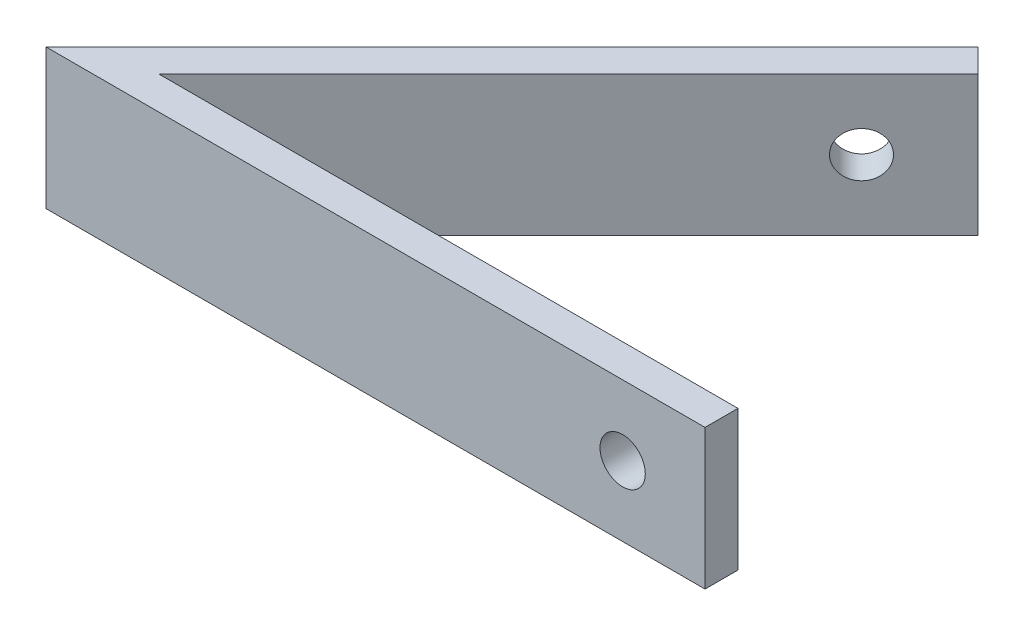
ISO-10303-21;
HEADER;
FILE_DESCRIPTION(('STEP AP214'),'2;1');
FILE_NAME('part.step','',(''),(''),'','','');
FILE_SCHEMA(('AUTOMOTIVE_DESIGN { 1 0 10303 214 1 1 1 1 }'));
ENDSEC;
DATA;
#1=APPLICATION_CONTEXT('core data for automotive mechanical design processes');
#2=APPLICATION_PROTOCOL_DEFINITION('international standard','automotive_design',2000,#1);
#3=PRODUCT_CONTEXT('',#1,'mechanical');
#4=PRODUCT('Part','Part','',(#3));
#5=PRODUCT_RELATED_PRODUCT_CATEGORY('part','',(#4));
#6=PRODUCT_DEFINITION_FORMATION('','',#4);
#7=PRODUCT_DEFINITION_CONTEXT('part definition',#1,'design');
#8=PRODUCT_DEFINITION('design','',#6,#7);
#9=PRODUCT_DEFINITION_SHAPE('','',#8);
#10=(LENGTH_UNIT() NAMED_UNIT(*) SI_UNIT(.MILLI.,.METRE.));
#11=(NAMED_UNIT(*) PLANE_ANGLE_UNIT() SI_UNIT($,.RADIAN.));
#12=(NAMED_UNIT(*) SI_UNIT($,.STERADIAN.) SOLID_ANGLE_UNIT());
#13=UNCERTAINTY_MEASURE_WITH_UNIT(LENGTH_MEASURE(1.E-05),#10,'distance_accuracy_value','');
#14=(GEOMETRIC_REPRESENTATION_CONTEXT(3) GLOBAL_UNCERTAINTY_ASSIGNED_CONTEXT((#13)) GLOBAL_UNIT_ASSIGNED_CONTEXT((#10,
#11,#12)) REPRESENTATION_CONTEXT('',''));
#15=CARTESIAN_POINT('',(0.,0.,0.));
#16=DIRECTION('',(0.,0.,1.));
#17=DIRECTION('',(1.,0.,0.));
#18=AXIS2_PLACEMENT_3D('',#15,#16,#17);
#19=CARTESIAN_POINT('',(80.,17.,0.));
#20=DIRECTION('',(-1.,0.,0.));
#21=DIRECTION('',(0.,0.,1.));
#22=AXIS2_PLACEMENT_3D('',#19,#20,#21);
#23=PLANE('',#22);
#24=DIRECTION('',(0.,0.,-1.));
#25=VECTOR('',#24,1.);
#26=CARTESIAN_POINT('',(80.,0.,0.));
#27=LINE('',#26,#25);
#28=CARTESIAN_POINT('',(80.,0.,0.));
#29=VERTEX_POINT('',#28);
#30=CARTESIAN_POINT('',(80.,0.,-4.));
#31=VERTEX_POINT('',#30);
#32=EDGE_CURVE('E120',#29,#31,#27,.T.);
#33=ORIENTED_EDGE('',*,*,#32,.T.);
#34=DIRECTION('',(0.,-1.,0.));
#35=VECTOR('',#34,1.);
#36=CARTESIAN_POINT('',(80.,17.,-4.));
#37=LINE('',#36,#35);
#38=CARTESIAN_POINT('',(80.,17.,-4.));
#39=VERTEX_POINT('',#38);
#40=EDGE_CURVE('E11',#39,#31,#37,.T.);
#41=ORIENTED_EDGE('',*,*,#40,.F.);
#42=DIRECTION('',(0.,0.,-1.));
#43=VECTOR('',#42,1.);
#44=CARTESIAN_POINT('',(80.,17.,0.));
#45=LINE('',#44,#43);
#46=CARTESIAN_POINT('',(80.,17.,0.));
#47=VERTEX_POINT('',#46);
#48=EDGE_CURVE('E130',#47,#39,#45,.T.);
#49=ORIENTED_EDGE('',*,*,#48,.F.);
#50=DIRECTION('',(0.,-1.,0.));
#51=VECTOR('',#50,1.);
#52=CARTESIAN_POINT('',(80.,17.,0.));
#53=LINE('',#52,#51);
#54=EDGE_CURVE('E116',#47,#29,#53,.T.);
#55=ORIENTED_EDGE('',*,*,#54,.T.);
#56=EDGE_LOOP('',(#33,#41,#49,#55));
#57=FACE_BOUND('',#56,.T.);
#58=ADVANCED_FACE('F35',(#57),#23,.F.);
#59=CARTESIAN_POINT('',(80.,17.,-4.));
#60=DIRECTION('',(0.,0.,1.));
#61=DIRECTION('',(1.,0.,0.));
#62=AXIS2_PLACEMENT_3D('',#59,#60,#61);
#63=PLANE('',#62);
#64=CARTESIAN_POINT('',(70.,8.5,-4.));
#65=DIRECTION('',(0.,0.,1.));
#66=DIRECTION('',(1.,0.,0.));
#67=AXIS2_PLACEMENT_3D('',#64,#65,#66);
#68=CIRCLE('',#67,2.75000000000001);
#69=CARTESIAN_POINT('',(72.75,8.5,-4.));
#70=VERTEX_POINT('',#69);
#71=EDGE_CURVE('E231',#70,#70,#68,.T.);
#72=ORIENTED_EDGE('',*,*,#71,.T.);
#73=EDGE_LOOP('',(#72));
#74=FACE_BOUND('',#73,.T.);
#75=DIRECTION('',(-1.,0.,0.));
#76=VECTOR('',#75,1.);
#77=CARTESIAN_POINT('',(80.,0.,-4.));
#78=LINE('',#77,#76);
#79=CARTESIAN_POINT('',(9.65685424949238,0.,-4.));
#80=VERTEX_POINT('',#79);
#81=EDGE_CURVE('E123',#31,#80,#78,.T.);
#82=ORIENTED_EDGE('',*,*,#81,.T.);
#83=DIRECTION('',(0.,-1.,0.));
#84=VECTOR('',#83,1.);
#85=CARTESIAN_POINT('',(9.65685424949238,17.,-4.));
#86=LINE('',#85,#84);
#87=CARTESIAN_POINT('',(9.65685424949238,17.,-4.));
#88=VERTEX_POINT('',#87);
#89=EDGE_CURVE('E44',#88,#80,#86,.T.);
#90=ORIENTED_EDGE('',*,*,#89,.F.);
#91=DIRECTION('',(-1.,0.,0.));
#92=VECTOR('',#91,1.);
#93=CARTESIAN_POINT('',(80.,17.,-4.));
#94=LINE('',#93,#92);
#95=EDGE_CURVE('E89',#39,#88,#94,.T.);
#96=ORIENTED_EDGE('',*,*,#95,.F.);
#97=ORIENTED_EDGE('',*,*,#40,.T.);
#98=EDGE_LOOP('',(#82,#90,#96,#97));
#99=FACE_BOUND('',#98,.T.);
#100=ADVANCED_FACE('F158',(#74,#99),#63,.F.);
#101=CARTESIAN_POINT('',(9.65685424949238,17.,-4.));
#102=DIRECTION('',(-0.707106781186547,0.,-0.707106781186548));
#103=DIRECTION('',(-0.707106781186548,0.,0.707106781186547));
#104=AXIS2_PLACEMENT_3D('',#101,#102,#103);
#105=PLANE('',#104);
#106=CARTESIAN_POINT('',(52.3259018078045,8.5,-46.6690475583121));
#107=DIRECTION('',(0.707106781186548,0.,0.707106781186548));
#108=DIRECTION('',(0.707106781186548,0.,-0.707106781186548));
#109=AXIS2_PLACEMENT_3D('',#106,#107,#108);
#110=CIRCLE('',#109,2.75000000000001);
#111=CARTESIAN_POINT('',(54.2704454560675,8.5,-48.6135912065752));
#112=VERTEX_POINT('',#111);
#113=EDGE_CURVE('E232',#112,#112,#110,.T.);
#114=ORIENTED_EDGE('',*,*,#113,.F.);
#115=EDGE_LOOP('',(#114));
#116=FACE_BOUND('',#115,.T.);
#117=DIRECTION('',(0.707106781186548,0.,-0.707106781186547));
#118=VECTOR('',#117,1.);
#119=CARTESIAN_POINT('',(9.65685424949238,0.,-4.));
#120=LINE('',#119,#118);
#121=CARTESIAN_POINT('',(59.39696961967,0.,-53.7401153701776));
#122=VERTEX_POINT('',#121);
#123=EDGE_CURVE('E125',#80,#122,#120,.T.);
#124=ORIENTED_EDGE('',*,*,#123,.T.);
#125=DIRECTION('',(0.,-1.,0.));
#126=VECTOR('',#125,1.);
#127=CARTESIAN_POINT('',(59.39696961967,17.,-53.7401153701776));
#128=LINE('',#127,#126);
#129=CARTESIAN_POINT('',(59.39696961967,17.,-53.7401153701776));
#130=VERTEX_POINT('',#129);
#131=EDGE_CURVE('E111',#130,#122,#128,.T.);
#132=ORIENTED_EDGE('',*,*,#131,.F.);
#133=DIRECTION('',(0.707106781186548,0.,-0.707106781186547));
#134=VECTOR('',#133,1.);
#135=CARTESIAN_POINT('',(9.65685424949238,17.,-4.));
#136=LINE('',#135,#134);
#137=EDGE_CURVE('E102',#88,#130,#136,.T.);
#138=ORIENTED_EDGE('',*,*,#137,.F.);
#139=ORIENTED_EDGE('',*,*,#89,.T.);
#140=EDGE_LOOP('',(#124,#132,#138,#139));
#141=FACE_BOUND('',#140,.T.);
#142=ADVANCED_FACE('F137',(#116,#141),#105,.F.);
#143=CARTESIAN_POINT('',(56.5685424949238,17.,-56.5685424949238));
#144=DIRECTION('',(-0.707106781186544,0.,0.707106781186551));
#145=DIRECTION('',(0.707106781186551,0.,0.707106781186544));
#146=AXIS2_PLACEMENT_3D('',#143,#144,#145);
#147=PLANE('',#146);
#148=DIRECTION('',(-0.707106781186551,0.,-0.707106781186544));
#149=VECTOR('',#148,1.);
#150=CARTESIAN_POINT('',(56.5685424949238,0.,-56.5685424949238));
#151=LINE('',#150,#149);
#152=CARTESIAN_POINT('',(56.5685424949238,0.,-56.5685424949238));
#153=VERTEX_POINT('',#152);
#154=EDGE_CURVE('E110',#122,#153,#151,.T.);
#155=ORIENTED_EDGE('',*,*,#154,.T.);
#156=DIRECTION('',(0.,-1.,0.));
#157=VECTOR('',#156,1.);
#158=CARTESIAN_POINT('',(56.5685424949238,17.,-56.5685424949238));
#159=LINE('',#158,#157);
#160=CARTESIAN_POINT('',(56.5685424949238,17.,-56.5685424949238));
#161=VERTEX_POINT('',#160);
#162=EDGE_CURVE('E107',#161,#153,#159,.T.);
#163=ORIENTED_EDGE('',*,*,#162,.F.);
#164=DIRECTION('',(-0.707106781186551,0.,-0.707106781186544));
#165=VECTOR('',#164,1.);
#166=CARTESIAN_POINT('',(56.5685424949238,17.,-56.5685424949238));
#167=LINE('',#166,#165);
#168=EDGE_CURVE('E96',#130,#161,#167,.T.);
#169=ORIENTED_EDGE('',*,*,#168,.F.);
#170=ORIENTED_EDGE('',*,*,#131,.T.);
#171=EDGE_LOOP('',(#155,#163,#169,#170));
#172=FACE_BOUND('',#171,.T.);
#173=ADVANCED_FACE('F108',(#172),#147,.F.);
#174=CARTESIAN_POINT('',(0.,17.,0.));
#175=DIRECTION('',(0.707106781186547,0.,0.707106781186547));
#176=DIRECTION('',(0.707106781186548,0.,-0.707106781186548));
#177=AXIS2_PLACEMENT_3D('',#174,#175,#176);
#178=PLANE('',#177);
#179=CARTESIAN_POINT('',(49.4974746830583,8.5,-49.4974746830583));
#180=DIRECTION('',(0.707106781186547,0.,0.707106781186547));
#181=DIRECTION('',(0.707106781186548,0.,-0.707106781186548));
#182=AXIS2_PLACEMENT_3D('',#179,#180,#181);
#183=CIRCLE('',#182,2.75000000000001);
#184=CARTESIAN_POINT('',(51.4420183313213,8.5,-51.4420183313213));
#185=VERTEX_POINT('',#184);
#186=EDGE_CURVE('E38',#185,#185,#183,.T.);
#187=ORIENTED_EDGE('',*,*,#186,.T.);
#188=EDGE_LOOP('',(#187));
#189=FACE_BOUND('',#188,.T.);
#190=DIRECTION('',(-0.707106781186548,0.,0.707106781186548));
#191=VECTOR('',#190,1.);
#192=CARTESIAN_POINT('',(0.,0.,0.));
#193=LINE('',#192,#191);
#194=CARTESIAN_POINT('',(0.,0.,0.));
#195=VERTEX_POINT('',#194);
#196=EDGE_CURVE('E75',#153,#195,#193,.T.);
#197=ORIENTED_EDGE('',*,*,#196,.T.);
#198=DIRECTION('',(0.,-1.,0.));
#199=VECTOR('',#198,1.);
#200=CARTESIAN_POINT('',(0.,17.,0.));
#201=LINE('',#200,#199);
#202=CARTESIAN_POINT('',(0.,17.,0.));
#203=VERTEX_POINT('',#202);
#204=EDGE_CURVE('E112',#203,#195,#201,.T.);
#205=ORIENTED_EDGE('',*,*,#204,.F.);
#206=DIRECTION('',(-0.707106781186548,0.,0.707106781186548));
#207=VECTOR('',#206,1.);
#208=CARTESIAN_POINT('',(0.,17.,0.));
#209=LINE('',#208,#207);
#210=EDGE_CURVE('E100',#161,#203,#209,.T.);
#211=ORIENTED_EDGE('',*,*,#210,.F.);
#212=ORIENTED_EDGE('',*,*,#162,.T.);
#213=EDGE_LOOP('',(#197,#205,#211,#212));
#214=FACE_BOUND('',#213,.T.);
#215=ADVANCED_FACE('F114',(#189,#214),#178,.F.);
#216=CARTESIAN_POINT('',(80.,17.,0.));
#217=DIRECTION('',(0.,0.,-1.));
#218=DIRECTION('',(-1.,0.,0.));
#219=AXIS2_PLACEMENT_3D('',#216,#217,#218);
#220=PLANE('',#219);
#221=CARTESIAN_POINT('',(70.,8.5,0.));
#222=DIRECTION('',(0.,0.,1.));
#223=DIRECTION('',(1.,0.,0.));
#224=AXIS2_PLACEMENT_3D('',#221,#222,#223);
#225=CIRCLE('',#224,2.75000000000001);
#226=CARTESIAN_POINT('',(72.75,8.5,0.));
#227=VERTEX_POINT('',#226);
#228=EDGE_CURVE('E229',#227,#227,#225,.T.);
#229=ORIENTED_EDGE('',*,*,#228,.F.);
#230=EDGE_LOOP('',(#229));
#231=FACE_BOUND('',#230,.T.);
#232=DIRECTION('',(1.,0.,0.));
#233=VECTOR('',#232,1.);
#234=CARTESIAN_POINT('',(80.,0.,0.));
#235=LINE('',#234,#233);
#236=EDGE_CURVE('E81',#195,#29,#235,.T.);
#237=ORIENTED_EDGE('',*,*,#236,.T.);
#238=ORIENTED_EDGE('',*,*,#54,.F.);
#239=DIRECTION('',(1.,0.,0.));
#240=VECTOR('',#239,1.);
#241=CARTESIAN_POINT('',(80.,17.,0.));
#242=LINE('',#241,#240);
#243=EDGE_CURVE('E52',#203,#47,#242,.T.);
#244=ORIENTED_EDGE('',*,*,#243,.F.);
#245=ORIENTED_EDGE('',*,*,#204,.T.);
#246=EDGE_LOOP('',(#237,#238,#244,#245));
#247=FACE_BOUND('',#246,.T.);
#248=ADVANCED_FACE('F144',(#231,#247),#220,.F.);
#249=CARTESIAN_POINT('',(0.,17.,0.));
#250=DIRECTION('',(0.,1.,0.));
#251=DIRECTION('',(0.,0.,1.));
#252=AXIS2_PLACEMENT_3D('',#249,#250,#251);
#253=PLANE('',#252);
#254=ORIENTED_EDGE('',*,*,#48,.T.);
#255=ORIENTED_EDGE('',*,*,#95,.T.);
#256=ORIENTED_EDGE('',*,*,#137,.T.);
#257=ORIENTED_EDGE('',*,*,#168,.T.);
#258=ORIENTED_EDGE('',*,*,#210,.T.);
#259=ORIENTED_EDGE('',*,*,#243,.T.);
#260=EDGE_LOOP('',(#254,#255,#256,#257,#258,#259));
#261=FACE_BOUND('',#260,.T.);
#262=ADVANCED_FACE('F98',(#261),#253,.T.);
#263=CARTESIAN_POINT('',(0.,0.,0.));
#264=DIRECTION('',(0.,1.,0.));
#265=DIRECTION('',(0.,0.,1.));
#266=AXIS2_PLACEMENT_3D('',#263,#264,#265);
#267=PLANE('',#266);
#268=ORIENTED_EDGE('',*,*,#32,.F.);
#269=ORIENTED_EDGE('',*,*,#236,.F.);
#270=ORIENTED_EDGE('',*,*,#196,.F.);
#271=ORIENTED_EDGE('',*,*,#154,.F.);
#272=ORIENTED_EDGE('',*,*,#123,.F.);
#273=ORIENTED_EDGE('',*,*,#81,.F.);
#274=EDGE_LOOP('',(#268,#269,#270,#271,#272,#273));
#275=FACE_BOUND('',#274,.T.);
#276=ADVANCED_FACE('F140',(#275),#267,.F.);
#277=CARTESIAN_POINT('',(40.3050865276332,8.5,-58.6898628384834));
#278=DIRECTION('',(0.707106781186547,0.,0.707106781186547));
#279=DIRECTION('',(0.707106781186548,0.,-0.707106781186548));
#280=AXIS2_PLACEMENT_3D('',#277,#278,#279);
#281=CYLINDRICAL_SURFACE('',#280,2.75000000000001);
#282=ORIENTED_EDGE('',*,*,#113,.T.);
#283=EDGE_LOOP('',(#282));
#284=FACE_BOUND('',#283,.T.);
#285=ORIENTED_EDGE('',*,*,#186,.F.);
#286=EDGE_LOOP('',(#285));
#287=FACE_BOUND('',#286,.T.);
#288=ADVANCED_FACE('F189',(#284,#287),#281,.F.);
#289=CARTESIAN_POINT('',(70.,8.5,-17.));
#290=DIRECTION('',(0.,0.,1.));
#291=DIRECTION('',(1.,0.,0.));
#292=AXIS2_PLACEMENT_3D('',#289,#290,#291);
#293=CYLINDRICAL_SURFACE('',#292,2.75000000000001);
#294=ORIENTED_EDGE('',*,*,#228,.T.);
#295=EDGE_LOOP('',(#294));
#296=FACE_BOUND('',#295,.T.);
#297=ORIENTED_EDGE('',*,*,#71,.F.);
#298=EDGE_LOOP('',(#297));
#299=FACE_BOUND('',#298,.T.);
#300=ADVANCED_FACE('F193',(#296,#299),#293,.F.);
#301=CLOSED_SHELL('',(#58,#100,#142,#173,#215,#248,#262,#276,#288,#300));
#302=MANIFOLD_SOLID_BREP('B2',#301);
#303=ADVANCED_BREP_SHAPE_REPRESENTATION('',(#18,#302),#14);
#304=SHAPE_DEFINITION_REPRESENTATION(#9,#303);
ENDSEC;
END-ISO-10303-21;
